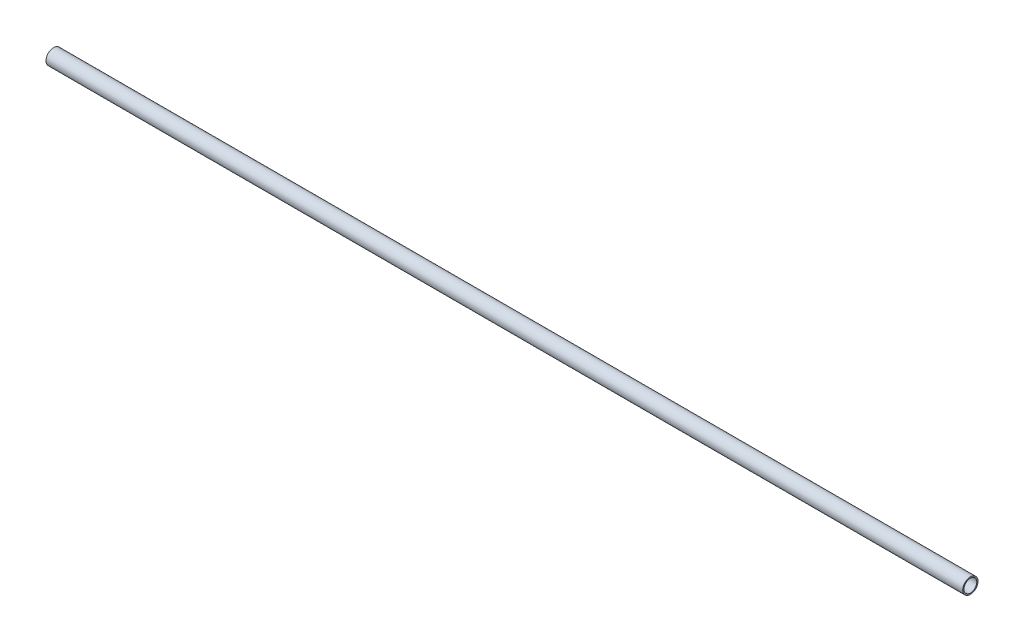
ISO-10303-21;
HEADER;
FILE_DESCRIPTION(('STEP AP214'),'2;1');
FILE_NAME('part.step','',(''),(''),'','','');
FILE_SCHEMA(('AUTOMOTIVE_DESIGN { 1 0 10303 214 1 1 1 1 }'));
ENDSEC;
DATA;
#1=APPLICATION_CONTEXT('core data for automotive mechanical design processes');
#2=APPLICATION_PROTOCOL_DEFINITION('international standard','automotive_design',2000,#1);
#3=PRODUCT_CONTEXT('',#1,'mechanical');
#4=PRODUCT('Part','Part','',(#3));
#5=PRODUCT_RELATED_PRODUCT_CATEGORY('part','',(#4));
#6=PRODUCT_DEFINITION_FORMATION('','',#4);
#7=PRODUCT_DEFINITION_CONTEXT('part definition',#1,'design');
#8=PRODUCT_DEFINITION('design','',#6,#7);
#9=PRODUCT_DEFINITION_SHAPE('','',#8);
#10=(LENGTH_UNIT() NAMED_UNIT(*) SI_UNIT(.MILLI.,.METRE.));
#11=(NAMED_UNIT(*) PLANE_ANGLE_UNIT() SI_UNIT($,.RADIAN.));
#12=(NAMED_UNIT(*) SI_UNIT($,.STERADIAN.) SOLID_ANGLE_UNIT());
#13=UNCERTAINTY_MEASURE_WITH_UNIT(LENGTH_MEASURE(1.E-05),#10,'distance_accuracy_value','');
#14=(GEOMETRIC_REPRESENTATION_CONTEXT(3) GLOBAL_UNCERTAINTY_ASSIGNED_CONTEXT((#13)) GLOBAL_UNIT_ASSIGNED_CONTEXT((#10,
#11,#12)) REPRESENTATION_CONTEXT('',''));
#15=CARTESIAN_POINT('',(0.,0.,0.));
#16=DIRECTION('',(0.,0.,1.));
#17=DIRECTION('',(1.,0.,0.));
#18=AXIS2_PLACEMENT_3D('',#15,#16,#17);
#19=CARTESIAN_POINT('',(1500.,0.,0.));
#20=DIRECTION('',(1.,0.,0.));
#21=DIRECTION('',(0.,0.,-1.));
#22=AXIS2_PLACEMENT_3D('',#19,#20,#21);
#23=PLANE('',#22);
#24=CARTESIAN_POINT('',(1500.,0.,0.));
#25=DIRECTION('',(1.,0.,0.));
#26=DIRECTION('',(0.,0.,-1.));
#27=AXIS2_PLACEMENT_3D('',#24,#25,#26);
#28=CIRCLE('',#27,12.5);
#29=CARTESIAN_POINT('',(1500.,0.,-12.5));
#30=VERTEX_POINT('',#29);
#31=EDGE_CURVE('E10',#30,#30,#28,.T.);
#32=ORIENTED_EDGE('',*,*,#31,.T.);
#33=EDGE_LOOP('',(#32));
#34=FACE_BOUND('',#33,.T.);
#35=CARTESIAN_POINT('',(1500.,0.,0.));
#36=DIRECTION('',(1.,0.,0.));
#37=DIRECTION('',(0.,0.,-1.));
#38=AXIS2_PLACEMENT_3D('',#35,#36,#37);
#39=CIRCLE('',#38,10.5);
#40=CARTESIAN_POINT('',(1500.,0.,-10.5));
#41=VERTEX_POINT('',#40);
#42=EDGE_CURVE('E42',#41,#41,#39,.T.);
#43=ORIENTED_EDGE('',*,*,#42,.F.);
#44=EDGE_LOOP('',(#43));
#45=FACE_BOUND('',#44,.T.);
#46=ADVANCED_FACE('F31',(#34,#45),#23,.T.);
#47=CARTESIAN_POINT('',(0.,0.,0.));
#48=DIRECTION('',(1.,0.,0.));
#49=DIRECTION('',(0.,0.,-1.));
#50=AXIS2_PLACEMENT_3D('',#47,#48,#49);
#51=PLANE('',#50);
#52=CARTESIAN_POINT('',(0.,0.,0.));
#53=DIRECTION('',(1.,0.,0.));
#54=DIRECTION('',(0.,0.,-1.));
#55=AXIS2_PLACEMENT_3D('',#52,#53,#54);
#56=CIRCLE('',#55,12.5);
#57=CARTESIAN_POINT('',(0.,0.,-12.5));
#58=VERTEX_POINT('',#57);
#59=EDGE_CURVE('E35',#58,#58,#56,.T.);
#60=ORIENTED_EDGE('',*,*,#59,.F.);
#61=EDGE_LOOP('',(#60));
#62=FACE_BOUND('',#61,.T.);
#63=CARTESIAN_POINT('',(0.,0.,0.));
#64=DIRECTION('',(1.,0.,0.));
#65=DIRECTION('',(0.,0.,-1.));
#66=AXIS2_PLACEMENT_3D('',#63,#64,#65);
#67=CIRCLE('',#66,10.5);
#68=CARTESIAN_POINT('',(0.,0.,-10.5));
#69=VERTEX_POINT('',#68);
#70=EDGE_CURVE('E44',#69,#69,#67,.T.);
#71=ORIENTED_EDGE('',*,*,#70,.T.);
#72=EDGE_LOOP('',(#71));
#73=FACE_BOUND('',#72,.T.);
#74=ADVANCED_FACE('F54',(#62,#73),#51,.F.);
#75=CARTESIAN_POINT('',(1500.,0.,0.));
#76=DIRECTION('',(-1.,0.,0.));
#77=DIRECTION('',(0.,0.,1.));
#78=AXIS2_PLACEMENT_3D('',#75,#76,#77);
#79=CYLINDRICAL_SURFACE('',#78,12.5);
#80=ORIENTED_EDGE('',*,*,#31,.F.);
#81=EDGE_LOOP('',(#80));
#82=FACE_BOUND('',#81,.T.);
#83=ORIENTED_EDGE('',*,*,#59,.T.);
#84=EDGE_LOOP('',(#83));
#85=FACE_BOUND('',#84,.T.);
#86=ADVANCED_FACE('F33',(#82,#85),#79,.T.);
#87=CARTESIAN_POINT('',(1500.,0.,0.));
#88=DIRECTION('',(-1.,0.,0.));
#89=DIRECTION('',(0.,0.,1.));
#90=AXIS2_PLACEMENT_3D('',#87,#88,#89);
#91=CYLINDRICAL_SURFACE('',#90,10.5);
#92=ORIENTED_EDGE('',*,*,#42,.T.);
#93=EDGE_LOOP('',(#92));
#94=FACE_BOUND('',#93,.T.);
#95=ORIENTED_EDGE('',*,*,#70,.F.);
#96=EDGE_LOOP('',(#95));
#97=FACE_BOUND('',#96,.T.);
#98=ADVANCED_FACE('F50',(#94,#97),#91,.F.);
#99=CLOSED_SHELL('',(#46,#74,#86,#98));
#100=MANIFOLD_SOLID_BREP('B2',#99);
#101=ADVANCED_BREP_SHAPE_REPRESENTATION('',(#18,#100),#14);
#102=SHAPE_DEFINITION_REPRESENTATION(#9,#101);
ENDSEC;
END-ISO-10303-21;
